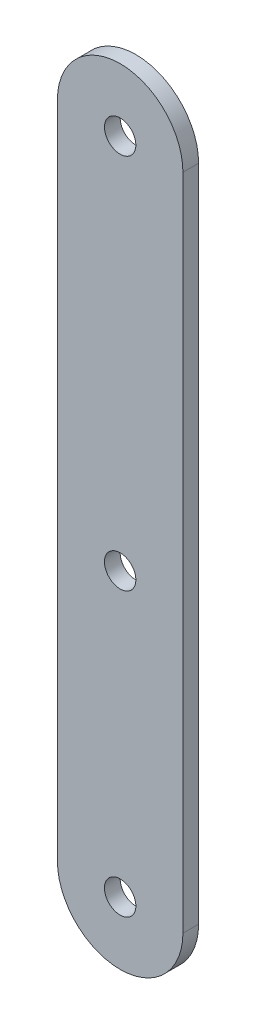
ISO-10303-21;
HEADER;
FILE_DESCRIPTION(('STEP AP214'),'2;1');
FILE_NAME('part.step','',(''),(''),'','','');
FILE_SCHEMA(('AUTOMOTIVE_DESIGN { 1 0 10303 214 1 1 1 1 }'));
ENDSEC;
DATA;
#1=APPLICATION_CONTEXT('core data for automotive mechanical design processes');
#2=APPLICATION_PROTOCOL_DEFINITION('international standard','automotive_design',2000,#1);
#3=PRODUCT_CONTEXT('',#1,'mechanical');
#4=PRODUCT('Part','Part','',(#3));
#5=PRODUCT_RELATED_PRODUCT_CATEGORY('part','',(#4));
#6=PRODUCT_DEFINITION_FORMATION('','',#4);
#7=PRODUCT_DEFINITION_CONTEXT('part definition',#1,'design');
#8=PRODUCT_DEFINITION('design','',#6,#7);
#9=PRODUCT_DEFINITION_SHAPE('','',#8);
#10=(LENGTH_UNIT() NAMED_UNIT(*) SI_UNIT(.MILLI.,.METRE.));
#11=(NAMED_UNIT(*) PLANE_ANGLE_UNIT() SI_UNIT($,.RADIAN.));
#12=(NAMED_UNIT(*) SI_UNIT($,.STERADIAN.) SOLID_ANGLE_UNIT());
#13=UNCERTAINTY_MEASURE_WITH_UNIT(LENGTH_MEASURE(1.E-05),#10,'distance_accuracy_value','');
#14=(GEOMETRIC_REPRESENTATION_CONTEXT(3) GLOBAL_UNCERTAINTY_ASSIGNED_CONTEXT((#13)) GLOBAL_UNIT_ASSIGNED_CONTEXT((#10,
#11,#12)) REPRESENTATION_CONTEXT('',''));
#15=CARTESIAN_POINT('',(0.,0.,0.));
#16=DIRECTION('',(0.,0.,1.));
#17=DIRECTION('',(1.,0.,0.));
#18=AXIS2_PLACEMENT_3D('',#15,#16,#17);
#19=CARTESIAN_POINT('',(0.,-533.4,12.7));
#20=DIRECTION('',(0.,0.,1.));
#21=DIRECTION('',(1.,0.,0.));
#22=AXIS2_PLACEMENT_3D('',#19,#20,#21);
#23=PLANE('',#22);
#24=CARTESIAN_POINT('',(0.,-533.4,12.7));
#25=DIRECTION('',(0.,0.,1.));
#26=DIRECTION('',(1.,0.,0.));
#27=AXIS2_PLACEMENT_3D('',#24,#25,#26);
#28=CIRCLE('',#27,12.7);
#29=CARTESIAN_POINT('',(12.7,-533.4,12.7));
#30=VERTEX_POINT('',#29);
#31=EDGE_CURVE('E117',#30,#30,#28,.T.);
#32=ORIENTED_EDGE('',*,*,#31,.F.);
#33=EDGE_LOOP('',(#32));
#34=FACE_BOUND('',#33,.T.);
#35=CARTESIAN_POINT('',(0.,-533.4,12.7));
#36=DIRECTION('',(0.,0.,1.));
#37=DIRECTION('',(1.,0.,0.));
#38=AXIS2_PLACEMENT_3D('',#35,#36,#37);
#39=CIRCLE('',#38,50.8);
#40=CARTESIAN_POINT('',(-50.8,-533.4,12.7));
#41=VERTEX_POINT('',#40);
#42=CARTESIAN_POINT('',(50.8,-533.4,12.7));
#43=VERTEX_POINT('',#42);
#44=EDGE_CURVE('E87',#41,#43,#39,.T.);
#45=ORIENTED_EDGE('',*,*,#44,.T.);
#46=DIRECTION('',(0.,1.,0.));
#47=VECTOR('',#46,1.);
#48=CARTESIAN_POINT('',(50.8,0.,12.7));
#49=LINE('',#48,#47);
#50=CARTESIAN_POINT('',(50.8,0.,12.7));
#51=VERTEX_POINT('',#50);
#52=EDGE_CURVE('E82',#43,#51,#49,.T.);
#53=ORIENTED_EDGE('',*,*,#52,.T.);
#54=CARTESIAN_POINT('',(0.,0.,12.7));
#55=DIRECTION('',(0.,0.,1.));
#56=DIRECTION('',(1.,0.,0.));
#57=AXIS2_PLACEMENT_3D('',#54,#55,#56);
#58=CIRCLE('',#57,50.8);
#59=CARTESIAN_POINT('',(-50.8,0.,12.7));
#60=VERTEX_POINT('',#59);
#61=EDGE_CURVE('E85',#51,#60,#58,.T.);
#62=ORIENTED_EDGE('',*,*,#61,.T.);
#63=DIRECTION('',(0.,-1.,0.));
#64=VECTOR('',#63,1.);
#65=CARTESIAN_POINT('',(-50.8,-533.4,12.7));
#66=LINE('',#65,#64);
#67=EDGE_CURVE('E52',#60,#41,#66,.T.);
#68=ORIENTED_EDGE('',*,*,#67,.T.);
#69=EDGE_LOOP('',(#45,#53,#62,#68));
#70=FACE_BOUND('',#69,.T.);
#71=CARTESIAN_POINT('',(0.,0.,12.7));
#72=DIRECTION('',(0.,0.,1.));
#73=DIRECTION('',(1.,0.,0.));
#74=AXIS2_PLACEMENT_3D('',#71,#72,#73);
#75=CIRCLE('',#74,12.7);
#76=CARTESIAN_POINT('',(12.7,0.,12.7));
#77=VERTEX_POINT('',#76);
#78=EDGE_CURVE('E102',#77,#77,#75,.T.);
#79=ORIENTED_EDGE('',*,*,#78,.F.);
#80=EDGE_LOOP('',(#79));
#81=FACE_BOUND('',#80,.T.);
#82=CARTESIAN_POINT('',(0.,-304.8,12.7));
#83=DIRECTION('',(0.,0.,1.));
#84=DIRECTION('',(1.,0.,0.));
#85=AXIS2_PLACEMENT_3D('',#82,#83,#84);
#86=CIRCLE('',#85,12.7);
#87=CARTESIAN_POINT('',(12.7,-304.8,12.7));
#88=VERTEX_POINT('',#87);
#89=EDGE_CURVE('E123',#88,#88,#86,.T.);
#90=ORIENTED_EDGE('',*,*,#89,.F.);
#91=EDGE_LOOP('',(#90));
#92=FACE_BOUND('',#91,.T.);
#93=ADVANCED_FACE('F35',(#34,#70,#81,#92),#23,.T.);
#94=CARTESIAN_POINT('',(0.,-533.4,0.));
#95=DIRECTION('',(0.,0.,1.));
#96=DIRECTION('',(1.,0.,0.));
#97=AXIS2_PLACEMENT_3D('',#94,#95,#96);
#98=PLANE('',#97);
#99=CARTESIAN_POINT('',(0.,-533.4,0.));
#100=DIRECTION('',(0.,0.,1.));
#101=DIRECTION('',(1.,0.,0.));
#102=AXIS2_PLACEMENT_3D('',#99,#100,#101);
#103=CIRCLE('',#102,50.8);
#104=CARTESIAN_POINT('',(-50.8,-533.4,0.));
#105=VERTEX_POINT('',#104);
#106=CARTESIAN_POINT('',(50.8,-533.4,0.));
#107=VERTEX_POINT('',#106);
#108=EDGE_CURVE('E99',#105,#107,#103,.T.);
#109=ORIENTED_EDGE('',*,*,#108,.F.);
#110=DIRECTION('',(0.,-1.,0.));
#111=VECTOR('',#110,1.);
#112=CARTESIAN_POINT('',(-50.8,-533.4,0.));
#113=LINE('',#112,#111);
#114=CARTESIAN_POINT('',(-50.8,0.,0.));
#115=VERTEX_POINT('',#114);
#116=EDGE_CURVE('E75',#115,#105,#113,.T.);
#117=ORIENTED_EDGE('',*,*,#116,.F.);
#118=CARTESIAN_POINT('',(0.,0.,0.));
#119=DIRECTION('',(0.,0.,1.));
#120=DIRECTION('',(1.,0.,0.));
#121=AXIS2_PLACEMENT_3D('',#118,#119,#120);
#122=CIRCLE('',#121,50.8);
#123=CARTESIAN_POINT('',(50.8,0.,0.));
#124=VERTEX_POINT('',#123);
#125=EDGE_CURVE('E69',#124,#115,#122,.T.);
#126=ORIENTED_EDGE('',*,*,#125,.F.);
#127=DIRECTION('',(0.,1.,0.));
#128=VECTOR('',#127,1.);
#129=CARTESIAN_POINT('',(50.8,0.,0.));
#130=LINE('',#129,#128);
#131=EDGE_CURVE('E91',#107,#124,#130,.T.);
#132=ORIENTED_EDGE('',*,*,#131,.F.);
#133=EDGE_LOOP('',(#109,#117,#126,#132));
#134=FACE_BOUND('',#133,.T.);
#135=CARTESIAN_POINT('',(0.,0.,0.));
#136=DIRECTION('',(0.,0.,1.));
#137=DIRECTION('',(1.,0.,0.));
#138=AXIS2_PLACEMENT_3D('',#135,#136,#137);
#139=CIRCLE('',#138,12.7);
#140=CARTESIAN_POINT('',(12.7,0.,0.));
#141=VERTEX_POINT('',#140);
#142=EDGE_CURVE('E114',#141,#141,#139,.T.);
#143=ORIENTED_EDGE('',*,*,#142,.T.);
#144=EDGE_LOOP('',(#143));
#145=FACE_BOUND('',#144,.T.);
#146=CARTESIAN_POINT('',(0.,-533.4,0.));
#147=DIRECTION('',(0.,0.,1.));
#148=DIRECTION('',(1.,0.,0.));
#149=AXIS2_PLACEMENT_3D('',#146,#147,#148);
#150=CIRCLE('',#149,12.7);
#151=CARTESIAN_POINT('',(12.7,-533.4,0.));
#152=VERTEX_POINT('',#151);
#153=EDGE_CURVE('E120',#152,#152,#150,.T.);
#154=ORIENTED_EDGE('',*,*,#153,.T.);
#155=EDGE_LOOP('',(#154));
#156=FACE_BOUND('',#155,.T.);
#157=CARTESIAN_POINT('',(0.,-304.8,0.));
#158=DIRECTION('',(0.,0.,1.));
#159=DIRECTION('',(1.,0.,0.));
#160=AXIS2_PLACEMENT_3D('',#157,#158,#159);
#161=CIRCLE('',#160,12.7);
#162=CARTESIAN_POINT('',(12.7,-304.8,0.));
#163=VERTEX_POINT('',#162);
#164=EDGE_CURVE('E126',#163,#163,#161,.T.);
#165=ORIENTED_EDGE('',*,*,#164,.T.);
#166=EDGE_LOOP('',(#165));
#167=FACE_BOUND('',#166,.T.);
#168=ADVANCED_FACE('F110',(#134,#145,#156,#167),#98,.F.);
#169=CARTESIAN_POINT('',(0.,-533.4,12.7));
#170=DIRECTION('',(0.,0.,-1.));
#171=DIRECTION('',(-1.,0.,0.));
#172=AXIS2_PLACEMENT_3D('',#169,#170,#171);
#173=CYLINDRICAL_SURFACE('',#172,50.8);
#174=ORIENTED_EDGE('',*,*,#108,.T.);
#175=DIRECTION('',(0.,0.,-1.));
#176=VECTOR('',#175,1.);
#177=CARTESIAN_POINT('',(50.8,-533.4,12.7));
#178=LINE('',#177,#176);
#179=EDGE_CURVE('E11',#43,#107,#178,.T.);
#180=ORIENTED_EDGE('',*,*,#179,.F.);
#181=ORIENTED_EDGE('',*,*,#44,.F.);
#182=DIRECTION('',(0.,0.,-1.));
#183=VECTOR('',#182,1.);
#184=CARTESIAN_POINT('',(-50.8,-533.4,12.7));
#185=LINE('',#184,#183);
#186=EDGE_CURVE('E95',#41,#105,#185,.T.);
#187=ORIENTED_EDGE('',*,*,#186,.T.);
#188=EDGE_LOOP('',(#174,#180,#181,#187));
#189=FACE_BOUND('',#188,.T.);
#190=ADVANCED_FACE('F37',(#189),#173,.T.);
#191=CARTESIAN_POINT('',(50.8,0.,12.7));
#192=DIRECTION('',(-1.,0.,0.));
#193=DIRECTION('',(0.,-1.,0.));
#194=AXIS2_PLACEMENT_3D('',#191,#192,#193);
#195=PLANE('',#194);
#196=ORIENTED_EDGE('',*,*,#131,.T.);
#197=DIRECTION('',(0.,0.,-1.));
#198=VECTOR('',#197,1.);
#199=CARTESIAN_POINT('',(50.8,0.,12.7));
#200=LINE('',#199,#198);
#201=EDGE_CURVE('E44',#51,#124,#200,.T.);
#202=ORIENTED_EDGE('',*,*,#201,.F.);
#203=ORIENTED_EDGE('',*,*,#52,.F.);
#204=ORIENTED_EDGE('',*,*,#179,.T.);
#205=EDGE_LOOP('',(#196,#202,#203,#204));
#206=FACE_BOUND('',#205,.T.);
#207=ADVANCED_FACE('F90',(#206),#195,.F.);
#208=CARTESIAN_POINT('',(0.,0.,12.7));
#209=DIRECTION('',(0.,0.,-1.));
#210=DIRECTION('',(-1.,0.,0.));
#211=AXIS2_PLACEMENT_3D('',#208,#209,#210);
#212=CYLINDRICAL_SURFACE('',#211,50.8);
#213=ORIENTED_EDGE('',*,*,#125,.T.);
#214=DIRECTION('',(0.,0.,-1.));
#215=VECTOR('',#214,1.);
#216=CARTESIAN_POINT('',(-50.8,0.,12.7));
#217=LINE('',#216,#215);
#218=EDGE_CURVE('E92',#60,#115,#217,.T.);
#219=ORIENTED_EDGE('',*,*,#218,.F.);
#220=ORIENTED_EDGE('',*,*,#61,.F.);
#221=ORIENTED_EDGE('',*,*,#201,.T.);
#222=EDGE_LOOP('',(#213,#219,#220,#221));
#223=FACE_BOUND('',#222,.T.);
#224=ADVANCED_FACE('F93',(#223),#212,.T.);
#225=CARTESIAN_POINT('',(-50.8,-533.4,12.7));
#226=DIRECTION('',(1.,0.,0.));
#227=DIRECTION('',(0.,1.,0.));
#228=AXIS2_PLACEMENT_3D('',#225,#226,#227);
#229=PLANE('',#228);
#230=ORIENTED_EDGE('',*,*,#116,.T.);
#231=ORIENTED_EDGE('',*,*,#186,.F.);
#232=ORIENTED_EDGE('',*,*,#67,.F.);
#233=ORIENTED_EDGE('',*,*,#218,.T.);
#234=EDGE_LOOP('',(#230,#231,#232,#233));
#235=FACE_BOUND('',#234,.T.);
#236=ADVANCED_FACE('F107',(#235),#229,.F.);
#237=CARTESIAN_POINT('',(0.,0.,12.7));
#238=DIRECTION('',(0.,0.,-1.));
#239=DIRECTION('',(-1.,0.,0.));
#240=AXIS2_PLACEMENT_3D('',#237,#238,#239);
#241=CYLINDRICAL_SURFACE('',#240,12.7);
#242=ORIENTED_EDGE('',*,*,#78,.T.);
#243=EDGE_LOOP('',(#242));
#244=FACE_BOUND('',#243,.T.);
#245=ORIENTED_EDGE('',*,*,#142,.F.);
#246=EDGE_LOOP('',(#245));
#247=FACE_BOUND('',#246,.T.);
#248=ADVANCED_FACE('F144',(#244,#247),#241,.F.);
#249=CARTESIAN_POINT('',(0.,-533.4,12.7));
#250=DIRECTION('',(0.,0.,-1.));
#251=DIRECTION('',(-1.,0.,0.));
#252=AXIS2_PLACEMENT_3D('',#249,#250,#251);
#253=CYLINDRICAL_SURFACE('',#252,12.7);
#254=ORIENTED_EDGE('',*,*,#31,.T.);
#255=EDGE_LOOP('',(#254));
#256=FACE_BOUND('',#255,.T.);
#257=ORIENTED_EDGE('',*,*,#153,.F.);
#258=EDGE_LOOP('',(#257));
#259=FACE_BOUND('',#258,.T.);
#260=ADVANCED_FACE('F190',(#256,#259),#253,.F.);
#261=CARTESIAN_POINT('',(0.,-304.8,12.7));
#262=DIRECTION('',(0.,0.,-1.));
#263=DIRECTION('',(-1.,0.,0.));
#264=AXIS2_PLACEMENT_3D('',#261,#262,#263);
#265=CYLINDRICAL_SURFACE('',#264,12.7);
#266=ORIENTED_EDGE('',*,*,#89,.T.);
#267=EDGE_LOOP('',(#266));
#268=FACE_BOUND('',#267,.T.);
#269=ORIENTED_EDGE('',*,*,#164,.F.);
#270=EDGE_LOOP('',(#269));
#271=FACE_BOUND('',#270,.T.);
#272=ADVANCED_FACE('F132',(#268,#271),#265,.F.);
#273=CLOSED_SHELL('',(#93,#168,#190,#207,#224,#236,#248,#260,#272));
#274=MANIFOLD_SOLID_BREP('B2',#273);
#275=ADVANCED_BREP_SHAPE_REPRESENTATION('',(#18,#274),#14);
#276=SHAPE_DEFINITION_REPRESENTATION(#9,#275);
ENDSEC;
END-ISO-10303-21;
